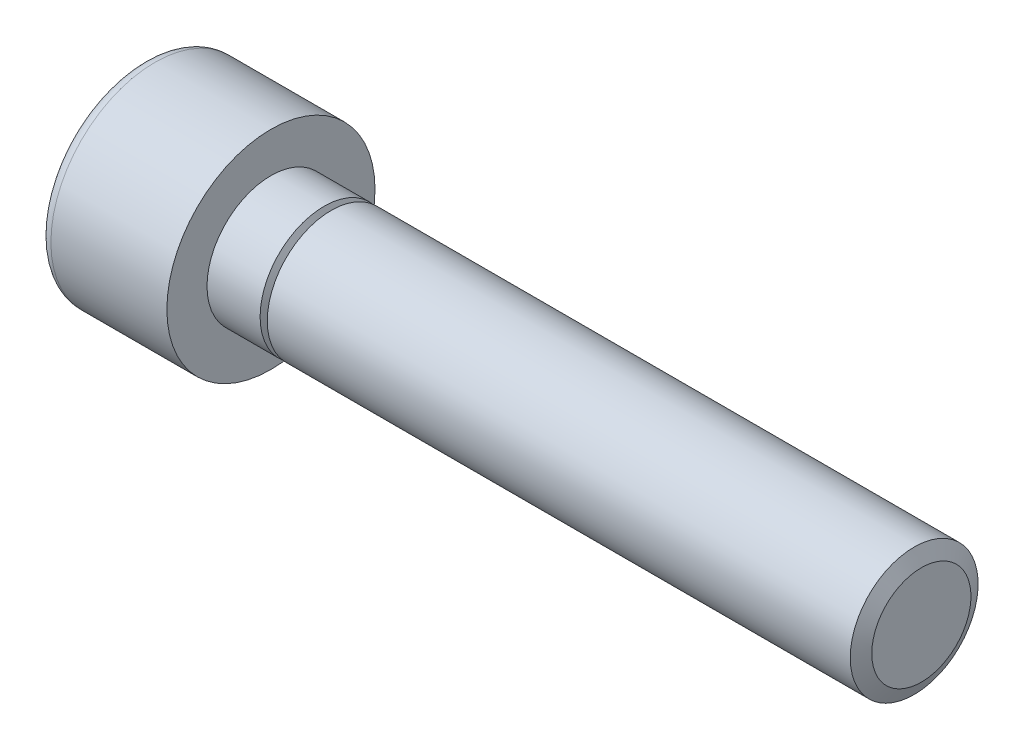
ISO-10303-21;
HEADER;
FILE_DESCRIPTION(('STEP AP214'),'2;1');
FILE_NAME('part.step','',(''),(''),'','','');
FILE_SCHEMA(('AUTOMOTIVE_DESIGN { 1 0 10303 214 1 1 1 1 }'));
ENDSEC;
DATA;
#1=APPLICATION_CONTEXT('core data for automotive mechanical design processes');
#2=APPLICATION_PROTOCOL_DEFINITION('international standard','automotive_design',2000,#1);
#3=PRODUCT_CONTEXT('',#1,'mechanical');
#4=PRODUCT('Part','Part','',(#3));
#5=PRODUCT_RELATED_PRODUCT_CATEGORY('part','',(#4));
#6=PRODUCT_DEFINITION_FORMATION('','',#4);
#7=PRODUCT_DEFINITION_CONTEXT('part definition',#1,'design');
#8=PRODUCT_DEFINITION('design','',#6,#7);
#9=PRODUCT_DEFINITION_SHAPE('','',#8);
#10=(LENGTH_UNIT() NAMED_UNIT(*) SI_UNIT(.MILLI.,.METRE.));
#11=(NAMED_UNIT(*) PLANE_ANGLE_UNIT() SI_UNIT($,.RADIAN.));
#12=(NAMED_UNIT(*) SI_UNIT($,.STERADIAN.) SOLID_ANGLE_UNIT());
#13=UNCERTAINTY_MEASURE_WITH_UNIT(LENGTH_MEASURE(1.E-05),#10,'distance_accuracy_value','');
#14=(GEOMETRIC_REPRESENTATION_CONTEXT(3) GLOBAL_UNCERTAINTY_ASSIGNED_CONTEXT((#13)) GLOBAL_UNIT_ASSIGNED_CONTEXT((#10,
#11,#12)) REPRESENTATION_CONTEXT('',''));
#15=CARTESIAN_POINT('',(0.,0.,0.));
#16=DIRECTION('',(0.,0.,1.));
#17=DIRECTION('',(1.,0.,0.));
#18=AXIS2_PLACEMENT_3D('',#15,#16,#17);
#19=CARTESIAN_POINT('',(-2.1844,0.,0.));
#20=DIRECTION('',(-1.,0.,0.));
#21=DIRECTION('',(0.,0.,1.));
#22=AXIS2_PLACEMENT_3D('',#19,#20,#21);
#23=PLANE('',#22);
#24=CARTESIAN_POINT('',(-2.1844,0.,0.));
#25=DIRECTION('',(-1.,0.,0.));
#26=DIRECTION('',(0.,0.,1.));
#27=AXIS2_PLACEMENT_3D('',#24,#25,#26);
#28=CIRCLE('',#27,1.5748);
#29=CARTESIAN_POINT('',(-2.1844,0.,1.5748));
#30=VERTEX_POINT('',#29);
#31=EDGE_CURVE('E105',#30,#30,#28,.T.);
#32=ORIENTED_EDGE('',*,*,#31,.T.);
#33=EDGE_LOOP('',(#32));
#34=FACE_BOUND('',#33,.T.);
#35=DIRECTION('',(0.,-1.,0.));
#36=VECTOR('',#35,1.);
#37=CARTESIAN_POINT('',(-2.1844,0.,0.9906));
#38=LINE('',#37,#36);
#39=CARTESIAN_POINT('',(-2.1844,0.571923176659244,0.9906));
#40=VERTEX_POINT('',#39);
#41=CARTESIAN_POINT('',(-2.1844,-0.571923176659243,0.9906));
#42=VERTEX_POINT('',#41);
#43=EDGE_CURVE('E133',#40,#42,#38,.T.);
#44=ORIENTED_EDGE('',*,*,#43,.T.);
#45=DIRECTION('',(0.,-0.5,-0.866025403784439));
#46=VECTOR('',#45,1.);
#47=CARTESIAN_POINT('',(-2.1844,-0.857884764988865,0.4953));
#48=LINE('',#47,#46);
#49=CARTESIAN_POINT('',(-2.1844,-1.14384635331849,0.));
#50=VERTEX_POINT('',#49);
#51=EDGE_CURVE('E10',#42,#50,#48,.T.);
#52=ORIENTED_EDGE('',*,*,#51,.T.);
#53=DIRECTION('',(0.,0.5,-0.866025403784439));
#54=VECTOR('',#53,1.);
#55=CARTESIAN_POINT('',(-2.1844,-0.857884764988866,-0.4953));
#56=LINE('',#55,#54);
#57=CARTESIAN_POINT('',(-2.1844,-0.571923176659244,-0.9906));
#58=VERTEX_POINT('',#57);
#59=EDGE_CURVE('E24',#50,#58,#56,.T.);
#60=ORIENTED_EDGE('',*,*,#59,.T.);
#61=DIRECTION('',(0.,1.,0.));
#62=VECTOR('',#61,1.);
#63=CARTESIAN_POINT('',(-2.1844,0.,-0.9906));
#64=LINE('',#63,#62);
#65=CARTESIAN_POINT('',(-2.1844,0.571923176659243,-0.9906));
#66=VERTEX_POINT('',#65);
#67=EDGE_CURVE('E145',#58,#66,#64,.T.);
#68=ORIENTED_EDGE('',*,*,#67,.T.);
#69=DIRECTION('',(0.,0.5,0.866025403784439));
#70=VECTOR('',#69,1.);
#71=CARTESIAN_POINT('',(-2.1844,0.857884764988865,-0.4953));
#72=LINE('',#71,#70);
#73=CARTESIAN_POINT('',(-2.1844,1.14384635331849,0.));
#74=VERTEX_POINT('',#73);
#75=EDGE_CURVE('E141',#66,#74,#72,.T.);
#76=ORIENTED_EDGE('',*,*,#75,.T.);
#77=DIRECTION('',(0.,-0.5,0.866025403784439));
#78=VECTOR('',#77,1.);
#79=CARTESIAN_POINT('',(-2.1844,0.857884764988865,0.4953));
#80=LINE('',#79,#78);
#81=EDGE_CURVE('E137',#74,#40,#80,.T.);
#82=ORIENTED_EDGE('',*,*,#81,.T.);
#83=EDGE_LOOP('',(#44,#52,#60,#68,#76,#82));
#84=FACE_BOUND('',#83,.T.);
#85=ADVANCED_FACE('F15',(#34,#84),#23,.T.);
#86=CARTESIAN_POINT('',(0.,-1.778,0.));
#87=DIRECTION('',(1.,0.,0.));
#88=DIRECTION('',(0.,0.,-1.));
#89=AXIS2_PLACEMENT_3D('',#86,#87,#88);
#90=PLANE('',#89);
#91=CARTESIAN_POINT('',(0.,0.,0.));
#92=DIRECTION('',(-1.,0.,0.));
#93=DIRECTION('',(0.,0.,1.));
#94=AXIS2_PLACEMENT_3D('',#91,#92,#93);
#95=CIRCLE('',#94,1.0922);
#96=CARTESIAN_POINT('',(0.,0.,1.0922));
#97=VERTEX_POINT('',#96);
#98=EDGE_CURVE('E129',#97,#97,#95,.T.);
#99=ORIENTED_EDGE('',*,*,#98,.T.);
#100=EDGE_LOOP('',(#99));
#101=FACE_BOUND('',#100,.T.);
#102=CARTESIAN_POINT('',(0.,0.,0.));
#103=DIRECTION('',(-1.,0.,0.));
#104=DIRECTION('',(0.,0.,1.));
#105=AXIS2_PLACEMENT_3D('',#102,#103,#104);
#106=CIRCLE('',#105,1.778);
#107=CARTESIAN_POINT('',(0.,0.,1.778));
#108=VERTEX_POINT('',#107);
#109=EDGE_CURVE('E87',#108,#108,#106,.T.);
#110=ORIENTED_EDGE('',*,*,#109,.F.);
#111=EDGE_LOOP('',(#110));
#112=FACE_BOUND('',#111,.T.);
#113=ADVANCED_FACE('F17',(#101,#112),#90,.T.);
#114=CARTESIAN_POINT('',(-2.1844,0.,0.));
#115=DIRECTION('',(-1.,0.,0.));
#116=DIRECTION('',(0.,0.,1.));
#117=AXIS2_PLACEMENT_3D('',#114,#115,#116);
#118=CYLINDRICAL_SURFACE('',#117,1.0922);
#119=CARTESIAN_POINT('',(0.907142857142857,0.,0.));
#120=DIRECTION('',(-1.,0.,0.));
#121=DIRECTION('',(0.,0.,1.));
#122=AXIS2_PLACEMENT_3D('',#119,#120,#121);
#123=CIRCLE('',#122,1.0922);
#124=CARTESIAN_POINT('',(0.907142857142857,0.,1.0922));
#125=VERTEX_POINT('',#124);
#126=EDGE_CURVE('E125',#125,#125,#123,.T.);
#127=ORIENTED_EDGE('',*,*,#126,.T.);
#128=EDGE_LOOP('',(#127));
#129=FACE_BOUND('',#128,.T.);
#130=ORIENTED_EDGE('',*,*,#98,.F.);
#131=EDGE_LOOP('',(#130));
#132=FACE_BOUND('',#131,.T.);
#133=ADVANCED_FACE('F331',(#129,#132),#118,.T.);
#134=CARTESIAN_POINT('',(0.907142857142857,0.,0.));
#135=DIRECTION('',(-1.,0.,0.));
#136=DIRECTION('',(0.,0.,1.));
#137=AXIS2_PLACEMENT_3D('',#134,#135,#136);
#138=CONICAL_SURFACE('',#137,1.0922,1.10714871779409);
#139=CARTESIAN_POINT('',(1.02969785714286,0.,0.));
#140=DIRECTION('',(-1.,0.,0.));
#141=DIRECTION('',(0.,0.,1.));
#142=AXIS2_PLACEMENT_3D('',#139,#140,#141);
#143=CIRCLE('',#142,0.84709);
#144=CARTESIAN_POINT('',(1.02969785714286,0.,0.84709));
#145=VERTEX_POINT('',#144);
#146=EDGE_CURVE('E121',#145,#145,#143,.T.);
#147=ORIENTED_EDGE('',*,*,#146,.T.);
#148=EDGE_LOOP('',(#147));
#149=FACE_BOUND('',#148,.T.);
#150=ORIENTED_EDGE('',*,*,#126,.F.);
#151=EDGE_LOOP('',(#150));
#152=FACE_BOUND('',#151,.T.);
#153=ADVANCED_FACE('F320',(#149,#152),#138,.T.);
#154=CARTESIAN_POINT('',(1.02969785714286,-0.84709,0.));
#155=DIRECTION('',(-1.,0.,0.));
#156=DIRECTION('',(0.,0.,1.));
#157=AXIS2_PLACEMENT_3D('',#154,#155,#156);
#158=PLANE('',#157);
#159=CARTESIAN_POINT('',(1.02969785714286,0.,0.));
#160=DIRECTION('',(-1.,0.,0.));
#161=DIRECTION('',(0.,0.,1.));
#162=AXIS2_PLACEMENT_3D('',#159,#160,#161);
#163=CIRCLE('',#162,1.0922);
#164=CARTESIAN_POINT('',(1.02969785714286,0.,1.0922));
#165=VERTEX_POINT('',#164);
#166=EDGE_CURVE('E117',#165,#165,#163,.T.);
#167=ORIENTED_EDGE('',*,*,#166,.T.);
#168=EDGE_LOOP('',(#167));
#169=FACE_BOUND('',#168,.T.);
#170=ORIENTED_EDGE('',*,*,#146,.F.);
#171=EDGE_LOOP('',(#170));
#172=FACE_BOUND('',#171,.T.);
#173=ADVANCED_FACE('F309',(#169,#172),#158,.T.);
#174=CARTESIAN_POINT('',(-2.1844,0.,0.));
#175=DIRECTION('',(-1.,0.,0.));
#176=DIRECTION('',(0.,0.,1.));
#177=AXIS2_PLACEMENT_3D('',#174,#175,#176);
#178=CYLINDRICAL_SURFACE('',#177,1.0922);
#179=CARTESIAN_POINT('',(10.989945,0.,0.));
#180=DIRECTION('',(-1.,0.,0.));
#181=DIRECTION('',(0.,0.,1.));
#182=AXIS2_PLACEMENT_3D('',#179,#180,#181);
#183=CIRCLE('',#182,1.0922);
#184=CARTESIAN_POINT('',(10.989945,0.,1.0922));
#185=VERTEX_POINT('',#184);
#186=EDGE_CURVE('E113',#185,#185,#183,.T.);
#187=ORIENTED_EDGE('',*,*,#186,.T.);
#188=EDGE_LOOP('',(#187));
#189=FACE_BOUND('',#188,.T.);
#190=ORIENTED_EDGE('',*,*,#166,.F.);
#191=EDGE_LOOP('',(#190));
#192=FACE_BOUND('',#191,.T.);
#193=ADVANCED_FACE('F298',(#189,#192),#178,.T.);
#194=CARTESIAN_POINT('',(10.989945,0.,0.));
#195=DIRECTION('',(-1.,0.,0.));
#196=DIRECTION('',(0.,0.,1.));
#197=AXIS2_PLACEMENT_3D('',#194,#195,#196);
#198=CONICAL_SURFACE('',#197,1.0922,1.10714871779408);
#199=CARTESIAN_POINT('',(11.1125,0.,0.));
#200=DIRECTION('',(-1.,0.,0.));
#201=DIRECTION('',(0.,0.,1.));
#202=AXIS2_PLACEMENT_3D('',#199,#200,#201);
#203=CIRCLE('',#202,0.84709);
#204=CARTESIAN_POINT('',(11.1125,0.,0.84709));
#205=VERTEX_POINT('',#204);
#206=EDGE_CURVE('E109',#205,#205,#203,.T.);
#207=ORIENTED_EDGE('',*,*,#206,.T.);
#208=EDGE_LOOP('',(#207));
#209=FACE_BOUND('',#208,.T.);
#210=ORIENTED_EDGE('',*,*,#186,.F.);
#211=EDGE_LOOP('',(#210));
#212=FACE_BOUND('',#211,.T.);
#213=ADVANCED_FACE('F287',(#209,#212),#198,.T.);
#214=CARTESIAN_POINT('',(11.1125,-0.84709,0.));
#215=DIRECTION('',(1.,0.,0.));
#216=DIRECTION('',(0.,0.,-1.));
#217=AXIS2_PLACEMENT_3D('',#214,#215,#216);
#218=PLANE('',#217);
#219=ORIENTED_EDGE('',*,*,#206,.F.);
#220=EDGE_LOOP('',(#219));
#221=FACE_BOUND('',#220,.T.);
#222=ADVANCED_FACE('F276',(#221),#218,.T.);
#223=CARTESIAN_POINT('',(-1.9812,0.,0.));
#224=DIRECTION('',(-1.,0.,0.));
#225=DIRECTION('',(0.,0.,1.));
#226=AXIS2_PLACEMENT_3D('',#223,#224,#225);
#227=TOROIDAL_SURFACE('',#226,1.5748,0.2032);
#228=CARTESIAN_POINT('',(-1.9812,0.,0.));
#229=DIRECTION('',(-1.,0.,0.));
#230=DIRECTION('',(0.,0.,1.));
#231=AXIS2_PLACEMENT_3D('',#228,#229,#230);
#232=CIRCLE('',#231,1.778);
#233=CARTESIAN_POINT('',(-1.9812,0.,1.778));
#234=VERTEX_POINT('',#233);
#235=EDGE_CURVE('E95',#234,#234,#232,.T.);
#236=ORIENTED_EDGE('',*,*,#235,.T.);
#237=EDGE_LOOP('',(#236));
#238=FACE_BOUND('',#237,.T.);
#239=ORIENTED_EDGE('',*,*,#31,.F.);
#240=EDGE_LOOP('',(#239));
#241=FACE_BOUND('',#240,.T.);
#242=ADVANCED_FACE('F265',(#238,#241),#227,.T.);
#243=CARTESIAN_POINT('',(-2.1844,0.,0.));
#244=DIRECTION('',(-1.,0.,0.));
#245=DIRECTION('',(0.,0.,1.));
#246=AXIS2_PLACEMENT_3D('',#243,#244,#245);
#247=CYLINDRICAL_SURFACE('',#246,1.778);
#248=ORIENTED_EDGE('',*,*,#109,.T.);
#249=EDGE_LOOP('',(#248));
#250=FACE_BOUND('',#249,.T.);
#251=ORIENTED_EDGE('',*,*,#235,.F.);
#252=EDGE_LOOP('',(#251));
#253=FACE_BOUND('',#252,.T.);
#254=ADVANCED_FACE('F255',(#250,#253),#247,.T.);
#255=CARTESIAN_POINT('',(-1.2192,-0.571923176659243,0.9906));
#256=DIRECTION('',(0.,0.866025403784439,-0.5));
#257=DIRECTION('',(0.,0.5,0.866025403784439));
#258=AXIS2_PLACEMENT_3D('',#255,#256,#257);
#259=PLANE('',#258);
#260=DIRECTION('',(-1.,0.,0.));
#261=VECTOR('',#260,1.);
#262=CARTESIAN_POINT('',(-1.2192,-0.571923176659243,0.9906));
#263=LINE('',#262,#261);
#264=CARTESIAN_POINT('',(-1.2192,-0.571923176659243,0.9906));
#265=VERTEX_POINT('',#264);
#266=EDGE_CURVE('E31',#265,#42,#263,.T.);
#267=ORIENTED_EDGE('',*,*,#266,.F.);
#268=DIRECTION('',(0.,-0.5,-0.866025403784438));
#269=VECTOR('',#268,1.);
#270=CARTESIAN_POINT('',(-1.2192,-0.571923176659243,0.9906));
#271=LINE('',#270,#269);
#272=CARTESIAN_POINT('',(-1.2192,-1.14384635331849,0.));
#273=VERTEX_POINT('',#272);
#274=EDGE_CURVE('E74',#265,#273,#271,.T.);
#275=ORIENTED_EDGE('',*,*,#274,.T.);
#276=DIRECTION('',(-1.,0.,0.));
#277=VECTOR('',#276,1.);
#278=CARTESIAN_POINT('',(-1.2192,-1.14384635331849,0.));
#279=LINE('',#278,#277);
#280=EDGE_CURVE('E82',#273,#50,#279,.T.);
#281=ORIENTED_EDGE('',*,*,#280,.T.);
#282=ORIENTED_EDGE('',*,*,#51,.F.);
#283=EDGE_LOOP('',(#267,#275,#281,#282));
#284=FACE_BOUND('',#283,.T.);
#285=ADVANCED_FACE('F81',(#284),#259,.T.);
#286=CARTESIAN_POINT('',(-1.2192,-1.14384635331849,0.));
#287=DIRECTION('',(0.,0.866025403784439,0.5));
#288=DIRECTION('',(0.,-0.5,0.866025403784439));
#289=AXIS2_PLACEMENT_3D('',#286,#287,#288);
#290=PLANE('',#289);
#291=ORIENTED_EDGE('',*,*,#280,.F.);
#292=DIRECTION('',(0.,0.5,-0.866025403784439));
#293=VECTOR('',#292,1.);
#294=CARTESIAN_POINT('',(-1.2192,-1.14384635331849,0.));
#295=LINE('',#294,#293);
#296=CARTESIAN_POINT('',(-1.2192,-0.571923176659244,-0.9906));
#297=VERTEX_POINT('',#296);
#298=EDGE_CURVE('E70',#273,#297,#295,.T.);
#299=ORIENTED_EDGE('',*,*,#298,.T.);
#300=DIRECTION('',(-1.,0.,0.));
#301=VECTOR('',#300,1.);
#302=CARTESIAN_POINT('',(-1.2192,-0.571923176659244,-0.9906));
#303=LINE('',#302,#301);
#304=EDGE_CURVE('E88',#297,#58,#303,.T.);
#305=ORIENTED_EDGE('',*,*,#304,.T.);
#306=ORIENTED_EDGE('',*,*,#59,.F.);
#307=EDGE_LOOP('',(#291,#299,#305,#306));
#308=FACE_BOUND('',#307,.T.);
#309=ADVANCED_FACE('F85',(#308),#290,.T.);
#310=CARTESIAN_POINT('',(-1.2192,-0.571923176659244,-0.9906));
#311=DIRECTION('',(0.,0.,1.));
#312=DIRECTION('',(0.,-1.,0.));
#313=AXIS2_PLACEMENT_3D('',#310,#311,#312);
#314=PLANE('',#313);
#315=ORIENTED_EDGE('',*,*,#304,.F.);
#316=DIRECTION('',(0.,1.,0.));
#317=VECTOR('',#316,1.);
#318=CARTESIAN_POINT('',(-1.2192,-0.571923176659244,-0.9906));
#319=LINE('',#318,#317);
#320=CARTESIAN_POINT('',(-1.2192,0.571923176659243,-0.9906));
#321=VERTEX_POINT('',#320);
#322=EDGE_CURVE('E76',#297,#321,#319,.T.);
#323=ORIENTED_EDGE('',*,*,#322,.T.);
#324=DIRECTION('',(-1.,0.,0.));
#325=VECTOR('',#324,1.);
#326=CARTESIAN_POINT('',(-1.2192,0.571923176659243,-0.9906));
#327=LINE('',#326,#325);
#328=EDGE_CURVE('E98',#321,#66,#327,.T.);
#329=ORIENTED_EDGE('',*,*,#328,.T.);
#330=ORIENTED_EDGE('',*,*,#67,.F.);
#331=EDGE_LOOP('',(#315,#323,#329,#330));
#332=FACE_BOUND('',#331,.T.);
#333=ADVANCED_FACE('F179',(#332),#314,.T.);
#334=CARTESIAN_POINT('',(-1.2192,0.571923176659243,-0.9906));
#335=DIRECTION('',(0.,-0.866025403784439,0.5));
#336=DIRECTION('',(0.,-0.5,-0.866025403784439));
#337=AXIS2_PLACEMENT_3D('',#334,#335,#336);
#338=PLANE('',#337);
#339=ORIENTED_EDGE('',*,*,#328,.F.);
#340=DIRECTION('',(0.,0.5,0.866025403784439));
#341=VECTOR('',#340,1.);
#342=CARTESIAN_POINT('',(-1.2192,0.571923176659243,-0.9906));
#343=LINE('',#342,#341);
#344=CARTESIAN_POINT('',(-1.2192,1.14384635331849,0.));
#345=VERTEX_POINT('',#344);
#346=EDGE_CURVE('E182',#321,#345,#343,.T.);
#347=ORIENTED_EDGE('',*,*,#346,.T.);
#348=DIRECTION('',(-1.,0.,0.));
#349=VECTOR('',#348,1.);
#350=CARTESIAN_POINT('',(-1.2192,1.14384635331849,0.));
#351=LINE('',#350,#349);
#352=EDGE_CURVE('E162',#345,#74,#351,.T.);
#353=ORIENTED_EDGE('',*,*,#352,.T.);
#354=ORIENTED_EDGE('',*,*,#75,.F.);
#355=EDGE_LOOP('',(#339,#347,#353,#354));
#356=FACE_BOUND('',#355,.T.);
#357=ADVANCED_FACE('F181',(#356),#338,.T.);
#358=CARTESIAN_POINT('',(-1.2192,1.14384635331849,0.));
#359=DIRECTION('',(0.,-0.866025403784439,-0.5));
#360=DIRECTION('',(0.,0.5,-0.866025403784439));
#361=AXIS2_PLACEMENT_3D('',#358,#359,#360);
#362=PLANE('',#361);
#363=ORIENTED_EDGE('',*,*,#352,.F.);
#364=DIRECTION('',(0.,-0.5,0.866025403784439));
#365=VECTOR('',#364,1.);
#366=CARTESIAN_POINT('',(-1.2192,1.14384635331849,0.));
#367=LINE('',#366,#365);
#368=CARTESIAN_POINT('',(-1.2192,0.571923176659244,0.9906));
#369=VERTEX_POINT('',#368);
#370=EDGE_CURVE('E160',#345,#369,#367,.T.);
#371=ORIENTED_EDGE('',*,*,#370,.T.);
#372=DIRECTION('',(-1.,0.,0.));
#373=VECTOR('',#372,1.);
#374=CARTESIAN_POINT('',(-1.2192,0.571923176659244,0.9906));
#375=LINE('',#374,#373);
#376=EDGE_CURVE('E154',#369,#40,#375,.T.);
#377=ORIENTED_EDGE('',*,*,#376,.T.);
#378=ORIENTED_EDGE('',*,*,#81,.F.);
#379=EDGE_LOOP('',(#363,#371,#377,#378));
#380=FACE_BOUND('',#379,.T.);
#381=ADVANCED_FACE('F157',(#380),#362,.T.);
#382=CARTESIAN_POINT('',(-1.2192,0.571923176659244,0.9906));
#383=DIRECTION('',(0.,0.,-1.));
#384=DIRECTION('',(0.,1.,0.));
#385=AXIS2_PLACEMENT_3D('',#382,#383,#384);
#386=PLANE('',#385);
#387=ORIENTED_EDGE('',*,*,#376,.F.);
#388=DIRECTION('',(0.,-1.,0.));
#389=VECTOR('',#388,1.);
#390=CARTESIAN_POINT('',(-1.2192,0.571923176659244,0.9906));
#391=LINE('',#390,#389);
#392=EDGE_CURVE('E170',#369,#265,#391,.T.);
#393=ORIENTED_EDGE('',*,*,#392,.T.);
#394=ORIENTED_EDGE('',*,*,#266,.T.);
#395=ORIENTED_EDGE('',*,*,#43,.F.);
#396=EDGE_LOOP('',(#387,#393,#394,#395));
#397=FACE_BOUND('',#396,.T.);
#398=ADVANCED_FACE('F153',(#397),#386,.T.);
#399=CARTESIAN_POINT('',(-1.2192,-1.14384635331849,0.));
#400=DIRECTION('',(1.,0.,0.));
#401=DIRECTION('',(0.,0.,1.));
#402=AXIS2_PLACEMENT_3D('',#399,#400,#401);
#403=PLANE('',#402);
#404=ORIENTED_EDGE('',*,*,#274,.F.);
#405=ORIENTED_EDGE('',*,*,#392,.F.);
#406=ORIENTED_EDGE('',*,*,#370,.F.);
#407=ORIENTED_EDGE('',*,*,#346,.F.);
#408=ORIENTED_EDGE('',*,*,#322,.F.);
#409=ORIENTED_EDGE('',*,*,#298,.F.);
#410=EDGE_LOOP('',(#404,#405,#406,#407,#408,#409));
#411=FACE_BOUND('',#410,.T.);
#412=ADVANCED_FACE('F72',(#411),#403,.F.);
#413=CLOSED_SHELL('',(#85,#113,#133,#153,#173,#193,#213,#222,#242,#254,#285,#309,#333,#357,#381,
#398,#412));
#414=MANIFOLD_SOLID_BREP('B1',#413);
#415=ADVANCED_BREP_SHAPE_REPRESENTATION('',(#18,#414),#14);
#416=SHAPE_DEFINITION_REPRESENTATION(#9,#415);
ENDSEC;
END-ISO-10303-21;
